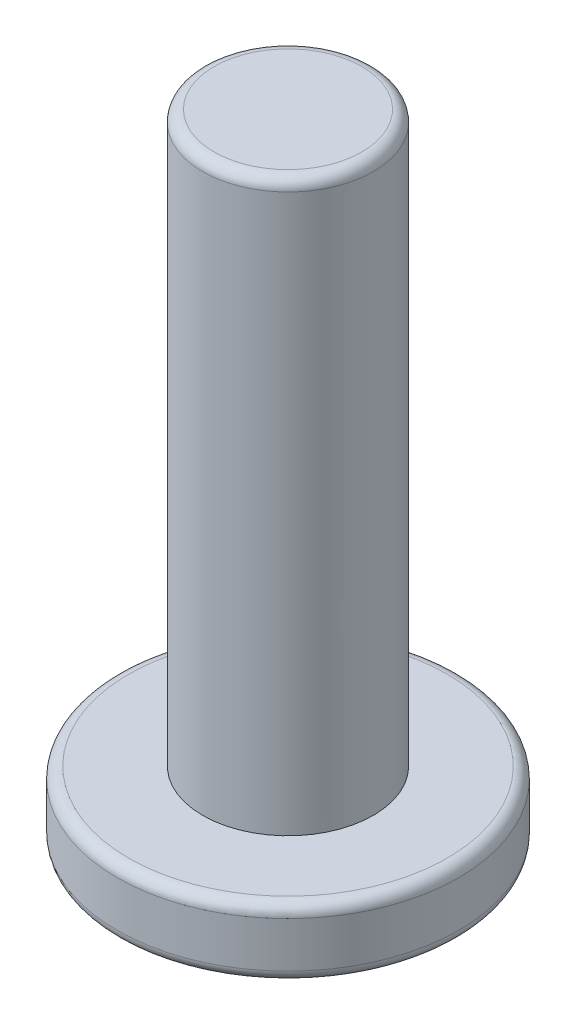
ISO-10303-21;
HEADER;
FILE_DESCRIPTION(('STEP AP214'),'2;1');
FILE_NAME('part.step','',(''),(''),'','','');
FILE_SCHEMA(('AUTOMOTIVE_DESIGN { 1 0 10303 214 1 1 1 1 }'));
ENDSEC;
DATA;
#1=APPLICATION_CONTEXT('core data for automotive mechanical design processes');
#2=APPLICATION_PROTOCOL_DEFINITION('international standard','automotive_design',2000,#1);
#3=PRODUCT_CONTEXT('',#1,'mechanical');
#4=PRODUCT('Part','Part','',(#3));
#5=PRODUCT_RELATED_PRODUCT_CATEGORY('part','',(#4));
#6=PRODUCT_DEFINITION_FORMATION('','',#4);
#7=PRODUCT_DEFINITION_CONTEXT('part definition',#1,'design');
#8=PRODUCT_DEFINITION('design','',#6,#7);
#9=PRODUCT_DEFINITION_SHAPE('','',#8);
#10=(LENGTH_UNIT() NAMED_UNIT(*) SI_UNIT(.MILLI.,.METRE.));
#11=(NAMED_UNIT(*) PLANE_ANGLE_UNIT() SI_UNIT($,.RADIAN.));
#12=(NAMED_UNIT(*) SI_UNIT($,.STERADIAN.) SOLID_ANGLE_UNIT());
#13=UNCERTAINTY_MEASURE_WITH_UNIT(LENGTH_MEASURE(1.E-05),#10,'distance_accuracy_value','');
#14=(GEOMETRIC_REPRESENTATION_CONTEXT(3) GLOBAL_UNCERTAINTY_ASSIGNED_CONTEXT((#13)) GLOBAL_UNIT_ASSIGNED_CONTEXT((#10,
#11,#12)) REPRESENTATION_CONTEXT('',''));
#15=CARTESIAN_POINT('',(0.,0.,0.));
#16=DIRECTION('',(0.,0.,1.));
#17=DIRECTION('',(1.,0.,0.));
#18=AXIS2_PLACEMENT_3D('',#15,#16,#17);
#19=CARTESIAN_POINT('',(0.,0.,0.));
#20=DIRECTION('',(0.,1.,0.));
#21=DIRECTION('',(0.,0.,1.));
#22=AXIS2_PLACEMENT_3D('',#19,#20,#21);
#23=PLANE('',#22);
#24=DIRECTION('',(-0.5,0.,0.866025403784439));
#25=VECTOR('',#24,1.);
#26=CARTESIAN_POINT('',(1.44337567297406,0.,0.));
#27=LINE('',#26,#25);
#28=CARTESIAN_POINT('',(1.44337567297406,0.,0.));
#29=VERTEX_POINT('',#28);
#30=CARTESIAN_POINT('',(0.721687836487032,0.,1.25));
#31=VERTEX_POINT('',#30);
#32=EDGE_CURVE('E122',#29,#31,#27,.T.);
#33=ORIENTED_EDGE('',*,*,#32,.F.);
#34=DIRECTION('',(0.5,0.,0.866025403784439));
#35=VECTOR('',#34,1.);
#36=CARTESIAN_POINT('',(0.721687836487032,0.,-1.25));
#37=LINE('',#36,#35);
#38=CARTESIAN_POINT('',(0.721687836487032,0.,-1.25));
#39=VERTEX_POINT('',#38);
#40=EDGE_CURVE('E48',#39,#29,#37,.T.);
#41=ORIENTED_EDGE('',*,*,#40,.F.);
#42=DIRECTION('',(1.,0.,0.));
#43=VECTOR('',#42,1.);
#44=CARTESIAN_POINT('',(-0.721687836487032,0.,-1.25));
#45=LINE('',#44,#43);
#46=CARTESIAN_POINT('',(-0.721687836487032,0.,-1.25));
#47=VERTEX_POINT('',#46);
#48=EDGE_CURVE('E131',#47,#39,#45,.T.);
#49=ORIENTED_EDGE('',*,*,#48,.F.);
#50=DIRECTION('',(0.5,0.,-0.866025403784439));
#51=VECTOR('',#50,1.);
#52=CARTESIAN_POINT('',(-1.44337567297407,0.,0.));
#53=LINE('',#52,#51);
#54=CARTESIAN_POINT('',(-1.44337567297407,0.,0.));
#55=VERTEX_POINT('',#54);
#56=EDGE_CURVE('E129',#55,#47,#53,.T.);
#57=ORIENTED_EDGE('',*,*,#56,.F.);
#58=DIRECTION('',(-0.5,0.,-0.866025403784439));
#59=VECTOR('',#58,1.);
#60=CARTESIAN_POINT('',(-0.721687836487033,0.,1.25));
#61=LINE('',#60,#59);
#62=CARTESIAN_POINT('',(-0.721687836487033,0.,1.25));
#63=VERTEX_POINT('',#62);
#64=EDGE_CURVE('E96',#63,#55,#61,.T.);
#65=ORIENTED_EDGE('',*,*,#64,.F.);
#66=DIRECTION('',(-1.,0.,0.));
#67=VECTOR('',#66,1.);
#68=CARTESIAN_POINT('',(0.721687836487032,0.,1.25));
#69=LINE('',#68,#67);
#70=EDGE_CURVE('E125',#31,#63,#69,.T.);
#71=ORIENTED_EDGE('',*,*,#70,.F.);
#72=EDGE_LOOP('',(#33,#41,#49,#57,#65,#71));
#73=FACE_BOUND('',#72,.T.);
#74=CARTESIAN_POINT('',(0.,0.,0.));
#75=DIRECTION('',(0.,1.,0.));
#76=DIRECTION('',(0.,0.,1.));
#77=AXIS2_PLACEMENT_3D('',#74,#75,#76);
#78=CIRCLE('',#77,2.8);
#79=CARTESIAN_POINT('',(0.,0.,2.8));
#80=VERTEX_POINT('',#79);
#81=EDGE_CURVE('E11',#80,#80,#78,.F.);
#82=ORIENTED_EDGE('',*,*,#81,.T.);
#83=EDGE_LOOP('',(#82));
#84=FACE_BOUND('',#83,.T.);
#85=ADVANCED_FACE('F33',(#73,#84),#23,.F.);
#86=CARTESIAN_POINT('',(0.,73.1142663620776,0.));
#87=DIRECTION('',(0.,1.,0.));
#88=DIRECTION('',(0.,0.,1.));
#89=AXIS2_PLACEMENT_3D('',#86,#87,#88);
#90=CYLINDRICAL_SURFACE('',#89,3.);
#91=CARTESIAN_POINT('',(0.,1.,0.));
#92=DIRECTION('',(0.,-1.,0.));
#93=DIRECTION('',(0.,0.,-1.));
#94=AXIS2_PLACEMENT_3D('',#91,#92,#93);
#95=CIRCLE('',#94,3.);
#96=CARTESIAN_POINT('',(0.,1.,-3.));
#97=VERTEX_POINT('',#96);
#98=EDGE_CURVE('E149',#97,#97,#95,.T.);
#99=ORIENTED_EDGE('',*,*,#98,.T.);
#100=EDGE_LOOP('',(#99));
#101=FACE_BOUND('',#100,.T.);
#102=CARTESIAN_POINT('',(0.,0.200000000000006,0.));
#103=DIRECTION('',(0.,1.,0.));
#104=DIRECTION('',(0.,0.,1.));
#105=AXIS2_PLACEMENT_3D('',#102,#103,#104);
#106=CIRCLE('',#105,3.);
#107=CARTESIAN_POINT('',(0.,0.200000000000006,3.));
#108=VERTEX_POINT('',#107);
#109=EDGE_CURVE('E146',#108,#108,#106,.T.);
#110=ORIENTED_EDGE('',*,*,#109,.T.);
#111=EDGE_LOOP('',(#110));
#112=FACE_BOUND('',#111,.T.);
#113=ADVANCED_FACE('F179',(#101,#112),#90,.T.);
#114=CARTESIAN_POINT('',(3.,1.2,0.));
#115=DIRECTION('',(0.,-1.,0.));
#116=DIRECTION('',(0.,0.,-1.));
#117=AXIS2_PLACEMENT_3D('',#114,#115,#116);
#118=PLANE('',#117);
#119=CARTESIAN_POINT('',(0.,1.2,0.));
#120=DIRECTION('',(0.,-1.,0.));
#121=DIRECTION('',(0.,0.,-1.));
#122=AXIS2_PLACEMENT_3D('',#119,#120,#121);
#123=CIRCLE('',#122,2.8);
#124=CARTESIAN_POINT('',(0.,1.2,-2.8));
#125=VERTEX_POINT('',#124);
#126=EDGE_CURVE('E143',#125,#125,#123,.F.);
#127=ORIENTED_EDGE('',*,*,#126,.T.);
#128=EDGE_LOOP('',(#127));
#129=FACE_BOUND('',#128,.T.);
#130=CARTESIAN_POINT('',(0.,1.19999999999999,0.));
#131=DIRECTION('',(0.,1.,0.));
#132=DIRECTION('',(0.,0.,1.));
#133=AXIS2_PLACEMENT_3D('',#130,#131,#132);
#134=CIRCLE('',#133,1.5);
#135=CARTESIAN_POINT('',(0.,1.19999999999999,1.5));
#136=VERTEX_POINT('',#135);
#137=EDGE_CURVE('E135',#136,#136,#134,.T.);
#138=ORIENTED_EDGE('',*,*,#137,.F.);
#139=EDGE_LOOP('',(#138));
#140=FACE_BOUND('',#139,.T.);
#141=ADVANCED_FACE('F175',(#129,#140),#118,.F.);
#142=CARTESIAN_POINT('',(0.,73.1142663620776,0.));
#143=DIRECTION('',(0.,1.,0.));
#144=DIRECTION('',(0.,0.,1.));
#145=AXIS2_PLACEMENT_3D('',#142,#143,#144);
#146=CYLINDRICAL_SURFACE('',#145,1.5);
#147=CARTESIAN_POINT('',(0.,11.,0.));
#148=DIRECTION('',(0.,-1.,0.));
#149=DIRECTION('',(0.,0.,-1.));
#150=AXIS2_PLACEMENT_3D('',#147,#148,#149);
#151=CIRCLE('',#150,1.5);
#152=CARTESIAN_POINT('',(0.,11.,-1.5));
#153=VERTEX_POINT('',#152);
#154=EDGE_CURVE('E41',#153,#153,#151,.T.);
#155=ORIENTED_EDGE('',*,*,#154,.T.);
#156=EDGE_LOOP('',(#155));
#157=FACE_BOUND('',#156,.T.);
#158=ORIENTED_EDGE('',*,*,#137,.T.);
#159=EDGE_LOOP('',(#158));
#160=FACE_BOUND('',#159,.T.);
#161=ADVANCED_FACE('F157',(#157,#160),#146,.T.);
#162=CARTESIAN_POINT('',(1.5,11.2,0.));
#163=DIRECTION('',(0.,-1.,0.));
#164=DIRECTION('',(0.,0.,-1.));
#165=AXIS2_PLACEMENT_3D('',#162,#163,#164);
#166=PLANE('',#165);
#167=CARTESIAN_POINT('',(0.,11.2,0.));
#168=DIRECTION('',(0.,-1.,0.));
#169=DIRECTION('',(0.,0.,-1.));
#170=AXIS2_PLACEMENT_3D('',#167,#168,#169);
#171=CIRCLE('',#170,1.3);
#172=CARTESIAN_POINT('',(0.,11.2,-1.3));
#173=VERTEX_POINT('',#172);
#174=EDGE_CURVE('E152',#173,#173,#171,.F.);
#175=ORIENTED_EDGE('',*,*,#174,.T.);
#176=EDGE_LOOP('',(#175));
#177=FACE_BOUND('',#176,.T.);
#178=ADVANCED_FACE('F166',(#177),#166,.F.);
#179=CARTESIAN_POINT('',(0.,1.,0.));
#180=DIRECTION('',(0.,-1.,0.));
#181=DIRECTION('',(0.,0.,-1.));
#182=AXIS2_PLACEMENT_3D('',#179,#180,#181);
#183=TOROIDAL_SURFACE('',#182,2.8,0.2);
#184=ORIENTED_EDGE('',*,*,#98,.F.);
#185=EDGE_LOOP('',(#184));
#186=FACE_BOUND('',#185,.T.);
#187=ORIENTED_EDGE('',*,*,#126,.F.);
#188=EDGE_LOOP('',(#187));
#189=FACE_BOUND('',#188,.T.);
#190=ADVANCED_FACE('F163',(#186,#189),#183,.T.);
#191=CARTESIAN_POINT('',(0.,11.,0.));
#192=DIRECTION('',(0.,-1.,0.));
#193=DIRECTION('',(0.,0.,-1.));
#194=AXIS2_PLACEMENT_3D('',#191,#192,#193);
#195=TOROIDAL_SURFACE('',#194,1.3,0.2);
#196=ORIENTED_EDGE('',*,*,#154,.F.);
#197=EDGE_LOOP('',(#196));
#198=FACE_BOUND('',#197,.T.);
#199=ORIENTED_EDGE('',*,*,#174,.F.);
#200=EDGE_LOOP('',(#199));
#201=FACE_BOUND('',#200,.T.);
#202=ADVANCED_FACE('F160',(#198,#201),#195,.T.);
#203=CARTESIAN_POINT('',(0.,0.200000000000006,0.));
#204=DIRECTION('',(0.,1.,0.));
#205=DIRECTION('',(0.,0.,1.));
#206=AXIS2_PLACEMENT_3D('',#203,#204,#205);
#207=TOROIDAL_SURFACE('',#206,2.8,0.2);
#208=ORIENTED_EDGE('',*,*,#81,.F.);
#209=EDGE_LOOP('',(#208));
#210=FACE_BOUND('',#209,.T.);
#211=ORIENTED_EDGE('',*,*,#109,.F.);
#212=EDGE_LOOP('',(#211));
#213=FACE_BOUND('',#212,.T.);
#214=ADVANCED_FACE('F35',(#210,#213),#207,.T.);
#215=CARTESIAN_POINT('',(0.721687836487032,1.,-1.25));
#216=DIRECTION('',(0.866025403784439,0.,-0.5));
#217=DIRECTION('',(-0.5,0.,-0.866025403784439));
#218=AXIS2_PLACEMENT_3D('',#215,#216,#217);
#219=PLANE('',#218);
#220=ORIENTED_EDGE('',*,*,#40,.T.);
#221=DIRECTION('',(0.,-1.,0.));
#222=VECTOR('',#221,1.);
#223=CARTESIAN_POINT('',(1.44337567297406,1.,0.));
#224=LINE('',#223,#222);
#225=CARTESIAN_POINT('',(1.44337567297406,1.,0.));
#226=VERTEX_POINT('',#225);
#227=EDGE_CURVE('E78',#226,#29,#224,.T.);
#228=ORIENTED_EDGE('',*,*,#227,.F.);
#229=DIRECTION('',(0.5,0.,0.866025403784439));
#230=VECTOR('',#229,1.);
#231=CARTESIAN_POINT('',(0.721687836487032,1.,-1.25));
#232=LINE('',#231,#230);
#233=CARTESIAN_POINT('',(0.721687836487032,1.,-1.25));
#234=VERTEX_POINT('',#233);
#235=EDGE_CURVE('E133',#234,#226,#232,.T.);
#236=ORIENTED_EDGE('',*,*,#235,.F.);
#237=DIRECTION('',(0.,-1.,0.));
#238=VECTOR('',#237,1.);
#239=CARTESIAN_POINT('',(0.721687836487032,1.,-1.25));
#240=LINE('',#239,#238);
#241=EDGE_CURVE('E56',#234,#39,#240,.T.);
#242=ORIENTED_EDGE('',*,*,#241,.T.);
#243=EDGE_LOOP('',(#220,#228,#236,#242));
#244=FACE_BOUND('',#243,.T.);
#245=ADVANCED_FACE('F228',(#244),#219,.F.);
#246=CARTESIAN_POINT('',(-0.721687836487032,1.,-1.25));
#247=DIRECTION('',(0.,0.,-1.));
#248=DIRECTION('',(-1.,0.,0.));
#249=AXIS2_PLACEMENT_3D('',#246,#247,#248);
#250=PLANE('',#249);
#251=ORIENTED_EDGE('',*,*,#48,.T.);
#252=ORIENTED_EDGE('',*,*,#241,.F.);
#253=DIRECTION('',(1.,0.,0.));
#254=VECTOR('',#253,1.);
#255=CARTESIAN_POINT('',(-0.721687836487032,1.,-1.25));
#256=LINE('',#255,#254);
#257=CARTESIAN_POINT('',(-0.721687836487032,1.,-1.25));
#258=VERTEX_POINT('',#257);
#259=EDGE_CURVE('E108',#258,#234,#256,.T.);
#260=ORIENTED_EDGE('',*,*,#259,.F.);
#261=DIRECTION('',(0.,-1.,0.));
#262=VECTOR('',#261,1.);
#263=CARTESIAN_POINT('',(-0.721687836487032,1.,-1.25));
#264=LINE('',#263,#262);
#265=EDGE_CURVE('E100',#258,#47,#264,.T.);
#266=ORIENTED_EDGE('',*,*,#265,.T.);
#267=EDGE_LOOP('',(#251,#252,#260,#266));
#268=FACE_BOUND('',#267,.T.);
#269=ADVANCED_FACE('F243',(#268),#250,.F.);
#270=CARTESIAN_POINT('',(-1.44337567297407,1.,0.));
#271=DIRECTION('',(-0.866025403784439,0.,-0.5));
#272=DIRECTION('',(-0.5,0.,0.866025403784439));
#273=AXIS2_PLACEMENT_3D('',#270,#271,#272);
#274=PLANE('',#273);
#275=ORIENTED_EDGE('',*,*,#56,.T.);
#276=ORIENTED_EDGE('',*,*,#265,.F.);
#277=DIRECTION('',(0.5,0.,-0.866025403784439));
#278=VECTOR('',#277,1.);
#279=CARTESIAN_POINT('',(-1.44337567297407,1.,0.));
#280=LINE('',#279,#278);
#281=CARTESIAN_POINT('',(-1.44337567297407,1.,0.));
#282=VERTEX_POINT('',#281);
#283=EDGE_CURVE('E104',#282,#258,#280,.T.);
#284=ORIENTED_EDGE('',*,*,#283,.F.);
#285=DIRECTION('',(0.,-1.,0.));
#286=VECTOR('',#285,1.);
#287=CARTESIAN_POINT('',(-1.44337567297407,1.,0.));
#288=LINE('',#287,#286);
#289=EDGE_CURVE('E89',#282,#55,#288,.T.);
#290=ORIENTED_EDGE('',*,*,#289,.T.);
#291=EDGE_LOOP('',(#275,#276,#284,#290));
#292=FACE_BOUND('',#291,.T.);
#293=ADVANCED_FACE('F105',(#292),#274,.F.);
#294=CARTESIAN_POINT('',(-0.721687836487033,1.,1.25));
#295=DIRECTION('',(-0.866025403784439,0.,0.5));
#296=DIRECTION('',(0.5,0.,0.866025403784439));
#297=AXIS2_PLACEMENT_3D('',#294,#295,#296);
#298=PLANE('',#297);
#299=ORIENTED_EDGE('',*,*,#64,.T.);
#300=ORIENTED_EDGE('',*,*,#289,.F.);
#301=DIRECTION('',(-0.5,0.,-0.866025403784439));
#302=VECTOR('',#301,1.);
#303=CARTESIAN_POINT('',(-0.721687836487033,1.,1.25));
#304=LINE('',#303,#302);
#305=CARTESIAN_POINT('',(-0.721687836487033,1.,1.25));
#306=VERTEX_POINT('',#305);
#307=EDGE_CURVE('E93',#306,#282,#304,.T.);
#308=ORIENTED_EDGE('',*,*,#307,.F.);
#309=DIRECTION('',(0.,-1.,0.));
#310=VECTOR('',#309,1.);
#311=CARTESIAN_POINT('',(-0.721687836487033,1.,1.25));
#312=LINE('',#311,#310);
#313=EDGE_CURVE('E101',#306,#63,#312,.T.);
#314=ORIENTED_EDGE('',*,*,#313,.T.);
#315=EDGE_LOOP('',(#299,#300,#308,#314));
#316=FACE_BOUND('',#315,.T.);
#317=ADVANCED_FACE('F91',(#316),#298,.F.);
#318=CARTESIAN_POINT('',(0.721687836487032,1.,1.25));
#319=DIRECTION('',(0.,0.,1.));
#320=DIRECTION('',(1.,0.,0.));
#321=AXIS2_PLACEMENT_3D('',#318,#319,#320);
#322=PLANE('',#321);
#323=ORIENTED_EDGE('',*,*,#70,.T.);
#324=ORIENTED_EDGE('',*,*,#313,.F.);
#325=DIRECTION('',(-1.,0.,0.));
#326=VECTOR('',#325,1.);
#327=CARTESIAN_POINT('',(0.721687836487032,1.,1.25));
#328=LINE('',#327,#326);
#329=CARTESIAN_POINT('',(0.721687836487032,1.,1.25));
#330=VERTEX_POINT('',#329);
#331=EDGE_CURVE('E114',#330,#306,#328,.T.);
#332=ORIENTED_EDGE('',*,*,#331,.F.);
#333=DIRECTION('',(0.,-1.,0.));
#334=VECTOR('',#333,1.);
#335=CARTESIAN_POINT('',(0.721687836487032,1.,1.25));
#336=LINE('',#335,#334);
#337=EDGE_CURVE('E138',#330,#31,#336,.T.);
#338=ORIENTED_EDGE('',*,*,#337,.T.);
#339=EDGE_LOOP('',(#323,#324,#332,#338));
#340=FACE_BOUND('',#339,.T.);
#341=ADVANCED_FACE('F267',(#340),#322,.F.);
#342=CARTESIAN_POINT('',(1.44337567297406,1.,0.));
#343=DIRECTION('',(0.866025403784439,0.,0.5));
#344=DIRECTION('',(0.5,0.,-0.866025403784439));
#345=AXIS2_PLACEMENT_3D('',#342,#343,#344);
#346=PLANE('',#345);
#347=ORIENTED_EDGE('',*,*,#32,.T.);
#348=ORIENTED_EDGE('',*,*,#337,.F.);
#349=DIRECTION('',(-0.5,0.,0.866025403784439));
#350=VECTOR('',#349,1.);
#351=CARTESIAN_POINT('',(1.44337567297406,1.,0.));
#352=LINE('',#351,#350);
#353=EDGE_CURVE('E116',#226,#330,#352,.T.);
#354=ORIENTED_EDGE('',*,*,#353,.F.);
#355=ORIENTED_EDGE('',*,*,#227,.T.);
#356=EDGE_LOOP('',(#347,#348,#354,#355));
#357=FACE_BOUND('',#356,.T.);
#358=ADVANCED_FACE('F276',(#357),#346,.F.);
#359=CARTESIAN_POINT('',(0.,1.,0.));
#360=DIRECTION('',(0.,-1.,0.));
#361=DIRECTION('',(0.,0.,-1.));
#362=AXIS2_PLACEMENT_3D('',#359,#360,#361);
#363=PLANE('',#362);
#364=ORIENTED_EDGE('',*,*,#235,.T.);
#365=ORIENTED_EDGE('',*,*,#353,.T.);
#366=ORIENTED_EDGE('',*,*,#331,.T.);
#367=ORIENTED_EDGE('',*,*,#307,.T.);
#368=ORIENTED_EDGE('',*,*,#283,.T.);
#369=ORIENTED_EDGE('',*,*,#259,.T.);
#370=EDGE_LOOP('',(#364,#365,#366,#367,#368,#369));
#371=FACE_BOUND('',#370,.T.);
#372=ADVANCED_FACE('F111',(#371),#363,.T.);
#373=CLOSED_SHELL('',(#85,#113,#141,#161,#178,#190,#202,#214,#245,#269,#293,#317,#341,#358,#372));
#374=MANIFOLD_SOLID_BREP('B2',#373);
#375=ADVANCED_BREP_SHAPE_REPRESENTATION('',(#18,#374),#14);
#376=SHAPE_DEFINITION_REPRESENTATION(#9,#375);
ENDSEC;
END-ISO-10303-21;
